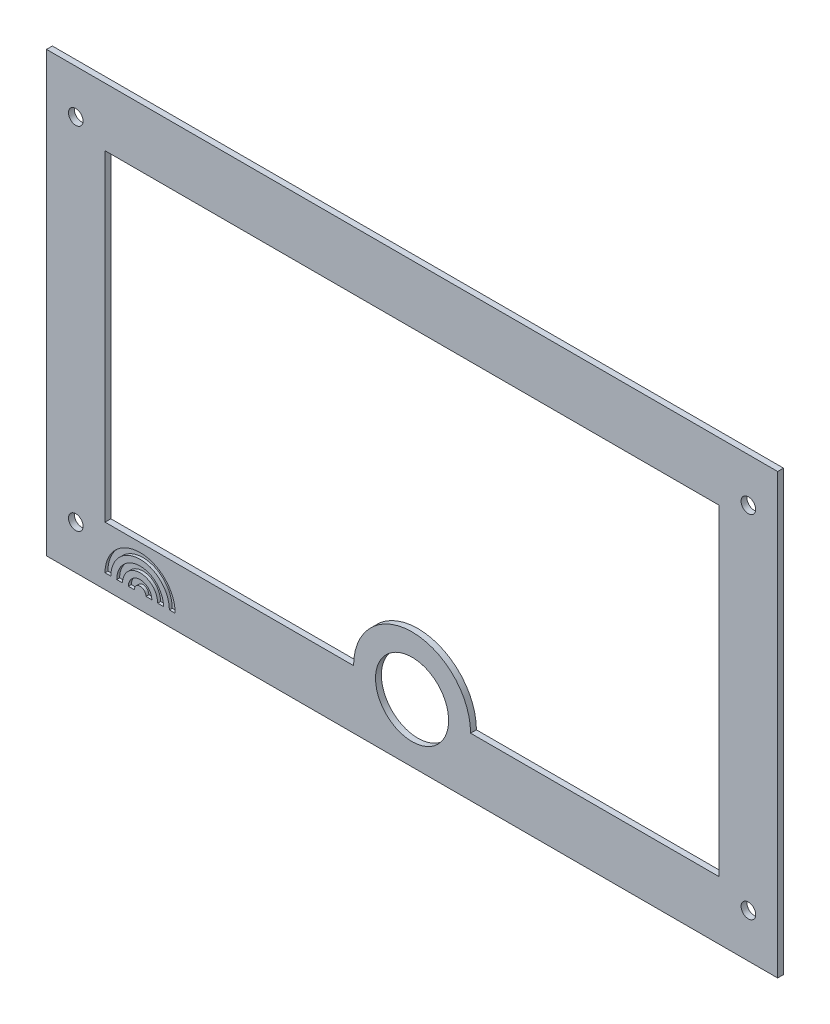
ISO-10303-21;
HEADER;
FILE_DESCRIPTION(('STEP AP214'),'2;1');
FILE_NAME('part.step','',(''),(''),'','','');
FILE_SCHEMA(('AUTOMOTIVE_DESIGN { 1 0 10303 214 1 1 1 1 }'));
ENDSEC;
DATA;
#1=APPLICATION_CONTEXT('core data for automotive mechanical design processes');
#2=APPLICATION_PROTOCOL_DEFINITION('international standard','automotive_design',2000,#1);
#3=PRODUCT_CONTEXT('',#1,'mechanical');
#4=PRODUCT('Part','Part','',(#3));
#5=PRODUCT_RELATED_PRODUCT_CATEGORY('part','',(#4));
#6=PRODUCT_DEFINITION_FORMATION('','',#4);
#7=PRODUCT_DEFINITION_CONTEXT('part definition',#1,'design');
#8=PRODUCT_DEFINITION('design','',#6,#7);
#9=PRODUCT_DEFINITION_SHAPE('','',#8);
#10=(LENGTH_UNIT() NAMED_UNIT(*) SI_UNIT(.MILLI.,.METRE.));
#11=(NAMED_UNIT(*) PLANE_ANGLE_UNIT() SI_UNIT($,.RADIAN.));
#12=(NAMED_UNIT(*) SI_UNIT($,.STERADIAN.) SOLID_ANGLE_UNIT());
#13=UNCERTAINTY_MEASURE_WITH_UNIT(LENGTH_MEASURE(1.E-05),#10,'distance_accuracy_value','');
#14=(GEOMETRIC_REPRESENTATION_CONTEXT(3) GLOBAL_UNCERTAINTY_ASSIGNED_CONTEXT((#13)) GLOBAL_UNIT_ASSIGNED_CONTEXT((#10,
#11,#12)) REPRESENTATION_CONTEXT('',''));
#15=CARTESIAN_POINT('',(0.,0.,0.));
#16=DIRECTION('',(0.,0.,1.));
#17=DIRECTION('',(1.,0.,0.));
#18=AXIS2_PLACEMENT_3D('',#15,#16,#17);
#19=CARTESIAN_POINT('',(-125.,-75.,2.));
#20=DIRECTION('',(0.,-1.,0.));
#21=DIRECTION('',(0.,0.,-1.));
#22=AXIS2_PLACEMENT_3D('',#19,#20,#21);
#23=PLANE('',#22);
#24=DIRECTION('',(1.,0.,0.));
#25=VECTOR('',#24,1.);
#26=CARTESIAN_POINT('',(0.,-75.,2.));
#27=LINE('',#26,#25);
#28=CARTESIAN_POINT('',(-125.,-75.,2.));
#29=VERTEX_POINT('',#28);
#30=CARTESIAN_POINT('',(125.,-75.,2.));
#31=VERTEX_POINT('',#30);
#32=EDGE_CURVE('E314',#29,#31,#27,.T.);
#33=ORIENTED_EDGE('',*,*,#32,.F.);
#34=DIRECTION('',(0.,0.,1.));
#35=VECTOR('',#34,1.);
#36=CARTESIAN_POINT('',(-125.,-75.,1.));
#37=LINE('',#36,#35);
#38=CARTESIAN_POINT('',(-125.,-75.,0.));
#39=VERTEX_POINT('',#38);
#40=EDGE_CURVE('E381',#39,#29,#37,.T.);
#41=ORIENTED_EDGE('',*,*,#40,.F.);
#42=DIRECTION('',(1.,0.,0.));
#43=VECTOR('',#42,1.);
#44=CARTESIAN_POINT('',(0.,-75.,0.));
#45=LINE('',#44,#43);
#46=CARTESIAN_POINT('',(125.,-75.,0.));
#47=VERTEX_POINT('',#46);
#48=EDGE_CURVE('E329',#39,#47,#45,.T.);
#49=ORIENTED_EDGE('',*,*,#48,.T.);
#50=DIRECTION('',(0.,0.,-1.));
#51=VECTOR('',#50,1.);
#52=CARTESIAN_POINT('',(125.,-75.,1.));
#53=LINE('',#52,#51);
#54=EDGE_CURVE('E286',#31,#47,#53,.T.);
#55=ORIENTED_EDGE('',*,*,#54,.F.);
#56=EDGE_LOOP('',(#33,#41,#49,#55));
#57=FACE_BOUND('',#56,.T.);
#58=ADVANCED_FACE('F50',(#57),#23,.T.);
#59=CARTESIAN_POINT('',(125.,-75.,2.));
#60=DIRECTION('',(1.,0.,0.));
#61=DIRECTION('',(0.,0.,-1.));
#62=AXIS2_PLACEMENT_3D('',#59,#60,#61);
#63=PLANE('',#62);
#64=DIRECTION('',(0.,1.,0.));
#65=VECTOR('',#64,1.);
#66=CARTESIAN_POINT('',(125.,0.,2.));
#67=LINE('',#66,#65);
#68=CARTESIAN_POINT('',(125.,75.,2.));
#69=VERTEX_POINT('',#68);
#70=EDGE_CURVE('E315',#31,#69,#67,.T.);
#71=ORIENTED_EDGE('',*,*,#70,.F.);
#72=ORIENTED_EDGE('',*,*,#54,.T.);
#73=DIRECTION('',(0.,1.,0.));
#74=VECTOR('',#73,1.);
#75=CARTESIAN_POINT('',(125.,0.,0.));
#76=LINE('',#75,#74);
#77=CARTESIAN_POINT('',(125.,75.,0.));
#78=VERTEX_POINT('',#77);
#79=EDGE_CURVE('E338',#47,#78,#76,.T.);
#80=ORIENTED_EDGE('',*,*,#79,.T.);
#81=DIRECTION('',(0.,0.,-1.));
#82=VECTOR('',#81,1.);
#83=CARTESIAN_POINT('',(125.,75.,1.));
#84=LINE('',#83,#82);
#85=EDGE_CURVE('E382',#69,#78,#84,.T.);
#86=ORIENTED_EDGE('',*,*,#85,.F.);
#87=EDGE_LOOP('',(#71,#72,#80,#86));
#88=FACE_BOUND('',#87,.T.);
#89=ADVANCED_FACE('F446',(#88),#63,.T.);
#90=CARTESIAN_POINT('',(-125.,75.,0.));
#91=DIRECTION('',(0.,1.,0.));
#92=DIRECTION('',(0.,0.,1.));
#93=AXIS2_PLACEMENT_3D('',#90,#91,#92);
#94=PLANE('',#93);
#95=DIRECTION('',(-1.,0.,0.));
#96=VECTOR('',#95,1.);
#97=CARTESIAN_POINT('',(0.,75.,2.));
#98=LINE('',#97,#96);
#99=CARTESIAN_POINT('',(-125.,75.,2.));
#100=VERTEX_POINT('',#99);
#101=EDGE_CURVE('E309',#69,#100,#98,.T.);
#102=ORIENTED_EDGE('',*,*,#101,.F.);
#103=ORIENTED_EDGE('',*,*,#85,.T.);
#104=DIRECTION('',(-1.,0.,0.));
#105=VECTOR('',#104,1.);
#106=CARTESIAN_POINT('',(0.,75.,0.));
#107=LINE('',#106,#105);
#108=CARTESIAN_POINT('',(-125.,75.,0.));
#109=VERTEX_POINT('',#108);
#110=EDGE_CURVE('E339',#78,#109,#107,.T.);
#111=ORIENTED_EDGE('',*,*,#110,.T.);
#112=DIRECTION('',(0.,0.,-1.));
#113=VECTOR('',#112,1.);
#114=CARTESIAN_POINT('',(-125.,75.,1.));
#115=LINE('',#114,#113);
#116=EDGE_CURVE('E367',#100,#109,#115,.T.);
#117=ORIENTED_EDGE('',*,*,#116,.F.);
#118=EDGE_LOOP('',(#102,#103,#111,#117));
#119=FACE_BOUND('',#118,.T.);
#120=ADVANCED_FACE('F445',(#119),#94,.T.);
#121=CARTESIAN_POINT('',(-125.,-75.,0.));
#122=DIRECTION('',(-1.,0.,0.));
#123=DIRECTION('',(0.,0.,1.));
#124=AXIS2_PLACEMENT_3D('',#121,#122,#123);
#125=PLANE('',#124);
#126=DIRECTION('',(0.,-1.,0.));
#127=VECTOR('',#126,1.);
#128=CARTESIAN_POINT('',(-125.,0.,2.));
#129=LINE('',#128,#127);
#130=EDGE_CURVE('E308',#100,#29,#129,.T.);
#131=ORIENTED_EDGE('',*,*,#130,.F.);
#132=ORIENTED_EDGE('',*,*,#116,.T.);
#133=DIRECTION('',(0.,-1.,0.));
#134=VECTOR('',#133,1.);
#135=CARTESIAN_POINT('',(-125.,0.,0.));
#136=LINE('',#135,#134);
#137=EDGE_CURVE('E334',#109,#39,#136,.T.);
#138=ORIENTED_EDGE('',*,*,#137,.T.);
#139=ORIENTED_EDGE('',*,*,#40,.T.);
#140=EDGE_LOOP('',(#131,#132,#138,#139));
#141=FACE_BOUND('',#140,.T.);
#142=ADVANCED_FACE('F453',(#141),#125,.T.);
#143=CARTESIAN_POINT('',(115.,-60.,0.));
#144=DIRECTION('',(0.,0.,1.));
#145=DIRECTION('',(1.,0.,0.));
#146=AXIS2_PLACEMENT_3D('',#143,#144,#145);
#147=CYLINDRICAL_SURFACE('',#146,2.5);
#148=CARTESIAN_POINT('',(115.,-60.,2.));
#149=DIRECTION('',(0.,0.,1.));
#150=DIRECTION('',(1.,0.,0.));
#151=AXIS2_PLACEMENT_3D('',#148,#149,#150);
#152=CIRCLE('',#151,2.5);
#153=CARTESIAN_POINT('',(117.5,-60.,2.));
#154=VERTEX_POINT('',#153);
#155=EDGE_CURVE('E310',#154,#154,#152,.F.);
#156=ORIENTED_EDGE('',*,*,#155,.F.);
#157=EDGE_LOOP('',(#156));
#158=FACE_BOUND('',#157,.T.);
#159=CARTESIAN_POINT('',(115.,-60.,0.));
#160=DIRECTION('',(0.,0.,1.));
#161=DIRECTION('',(1.,0.,0.));
#162=AXIS2_PLACEMENT_3D('',#159,#160,#161);
#163=CIRCLE('',#162,2.5);
#164=CARTESIAN_POINT('',(117.5,-60.,0.));
#165=VERTEX_POINT('',#164);
#166=EDGE_CURVE('E51',#165,#165,#163,.F.);
#167=ORIENTED_EDGE('',*,*,#166,.T.);
#168=EDGE_LOOP('',(#167));
#169=FACE_BOUND('',#168,.T.);
#170=ADVANCED_FACE('F422',(#158,#169),#147,.F.);
#171=CARTESIAN_POINT('',(115.,60.,0.));
#172=DIRECTION('',(0.,0.,1.));
#173=DIRECTION('',(1.,0.,0.));
#174=AXIS2_PLACEMENT_3D('',#171,#172,#173);
#175=CYLINDRICAL_SURFACE('',#174,2.5);
#176=CARTESIAN_POINT('',(115.,60.,2.));
#177=DIRECTION('',(0.,0.,1.));
#178=DIRECTION('',(1.,0.,0.));
#179=AXIS2_PLACEMENT_3D('',#176,#177,#178);
#180=CIRCLE('',#179,2.5);
#181=CARTESIAN_POINT('',(117.5,60.,2.));
#182=VERTEX_POINT('',#181);
#183=EDGE_CURVE('E410',#182,#182,#180,.F.);
#184=ORIENTED_EDGE('',*,*,#183,.F.);
#185=EDGE_LOOP('',(#184));
#186=FACE_BOUND('',#185,.T.);
#187=CARTESIAN_POINT('',(115.,60.,0.));
#188=DIRECTION('',(0.,0.,1.));
#189=DIRECTION('',(1.,0.,0.));
#190=AXIS2_PLACEMENT_3D('',#187,#188,#189);
#191=CIRCLE('',#190,2.5);
#192=CARTESIAN_POINT('',(117.5,60.,0.));
#193=VERTEX_POINT('',#192);
#194=EDGE_CURVE('E416',#193,#193,#191,.F.);
#195=ORIENTED_EDGE('',*,*,#194,.T.);
#196=EDGE_LOOP('',(#195));
#197=FACE_BOUND('',#196,.T.);
#198=ADVANCED_FACE('F521',(#186,#197),#175,.F.);
#199=CARTESIAN_POINT('',(-115.,60.,0.));
#200=DIRECTION('',(0.,0.,1.));
#201=DIRECTION('',(1.,0.,0.));
#202=AXIS2_PLACEMENT_3D('',#199,#200,#201);
#203=CYLINDRICAL_SURFACE('',#202,2.5);
#204=CARTESIAN_POINT('',(-115.,60.,2.));
#205=DIRECTION('',(0.,0.,1.));
#206=DIRECTION('',(1.,0.,0.));
#207=AXIS2_PLACEMENT_3D('',#204,#205,#206);
#208=CIRCLE('',#207,2.5);
#209=CARTESIAN_POINT('',(-112.5,60.,2.));
#210=VERTEX_POINT('',#209);
#211=EDGE_CURVE('E403',#210,#210,#208,.F.);
#212=ORIENTED_EDGE('',*,*,#211,.F.);
#213=EDGE_LOOP('',(#212));
#214=FACE_BOUND('',#213,.T.);
#215=CARTESIAN_POINT('',(-115.,60.,0.));
#216=DIRECTION('',(0.,0.,1.));
#217=DIRECTION('',(1.,0.,0.));
#218=AXIS2_PLACEMENT_3D('',#215,#216,#217);
#219=CIRCLE('',#218,2.5);
#220=CARTESIAN_POINT('',(-112.5,60.,0.));
#221=VERTEX_POINT('',#220);
#222=EDGE_CURVE('E330',#221,#221,#219,.F.);
#223=ORIENTED_EDGE('',*,*,#222,.T.);
#224=EDGE_LOOP('',(#223));
#225=FACE_BOUND('',#224,.T.);
#226=ADVANCED_FACE('F518',(#214,#225),#203,.F.);
#227=CARTESIAN_POINT('',(0.,-55.,2.));
#228=DIRECTION('',(0.,0.,-1.));
#229=DIRECTION('',(-1.,0.,0.));
#230=AXIS2_PLACEMENT_3D('',#227,#228,#229);
#231=CYLINDRICAL_SURFACE('',#230,12.5);
#232=CARTESIAN_POINT('',(0.,-55.,2.));
#233=DIRECTION('',(0.,0.,-1.));
#234=DIRECTION('',(-1.,0.,0.));
#235=AXIS2_PLACEMENT_3D('',#232,#233,#234);
#236=CIRCLE('',#235,12.5);
#237=CARTESIAN_POINT('',(-12.5,-55.,2.));
#238=VERTEX_POINT('',#237);
#239=EDGE_CURVE('E372',#238,#238,#236,.T.);
#240=ORIENTED_EDGE('',*,*,#239,.F.);
#241=EDGE_LOOP('',(#240));
#242=FACE_BOUND('',#241,.T.);
#243=CARTESIAN_POINT('',(0.,-55.,0.));
#244=DIRECTION('',(0.,0.,-1.));
#245=DIRECTION('',(-1.,0.,0.));
#246=AXIS2_PLACEMENT_3D('',#243,#244,#245);
#247=CIRCLE('',#246,12.5);
#248=CARTESIAN_POINT('',(-12.5,-55.,0.));
#249=VERTEX_POINT('',#248);
#250=EDGE_CURVE('E316',#249,#249,#247,.T.);
#251=ORIENTED_EDGE('',*,*,#250,.T.);
#252=EDGE_LOOP('',(#251));
#253=FACE_BOUND('',#252,.T.);
#254=ADVANCED_FACE('F513',(#242,#253),#231,.F.);
#255=CARTESIAN_POINT('',(105.,55.00000005,0.));
#256=DIRECTION('',(0.,1.,0.));
#257=DIRECTION('',(-1.,0.,0.));
#258=AXIS2_PLACEMENT_3D('',#255,#256,#257);
#259=PLANE('',#258);
#260=DIRECTION('',(0.,0.,1.));
#261=VECTOR('',#260,1.);
#262=CARTESIAN_POINT('',(105.,55.00000005,1.));
#263=LINE('',#262,#261);
#264=CARTESIAN_POINT('',(105.,55.00000005,0.));
#265=VERTEX_POINT('',#264);
#266=CARTESIAN_POINT('',(105.,55.00000005,2.));
#267=VERTEX_POINT('',#266);
#268=EDGE_CURVE('E363',#265,#267,#263,.T.);
#269=ORIENTED_EDGE('',*,*,#268,.T.);
#270=DIRECTION('',(1.,0.,0.));
#271=VECTOR('',#270,1.);
#272=CARTESIAN_POINT('',(0.,55.00000005,2.));
#273=LINE('',#272,#271);
#274=CARTESIAN_POINT('',(-105.,55.00000005,2.));
#275=VERTEX_POINT('',#274);
#276=EDGE_CURVE('E364',#275,#267,#273,.T.);
#277=ORIENTED_EDGE('',*,*,#276,.F.);
#278=DIRECTION('',(0.,0.,-1.));
#279=VECTOR('',#278,1.);
#280=CARTESIAN_POINT('',(-105.,55.00000005,1.));
#281=LINE('',#280,#279);
#282=CARTESIAN_POINT('',(-105.,55.00000005,0.));
#283=VERTEX_POINT('',#282);
#284=EDGE_CURVE('E345',#275,#283,#281,.T.);
#285=ORIENTED_EDGE('',*,*,#284,.T.);
#286=DIRECTION('',(1.,0.,0.));
#287=VECTOR('',#286,1.);
#288=CARTESIAN_POINT('',(0.,55.00000005,0.));
#289=LINE('',#288,#287);
#290=EDGE_CURVE('E389',#283,#265,#289,.T.);
#291=ORIENTED_EDGE('',*,*,#290,.T.);
#292=EDGE_LOOP('',(#269,#277,#285,#291));
#293=FACE_BOUND('',#292,.T.);
#294=ADVANCED_FACE('F520',(#293),#259,.F.);
#295=CARTESIAN_POINT('',(105.,-55.000000025,2.));
#296=DIRECTION('',(1.,0.,0.));
#297=DIRECTION('',(0.,0.,-1.));
#298=AXIS2_PLACEMENT_3D('',#295,#296,#297);
#299=PLANE('',#298);
#300=DIRECTION('',(0.,0.,1.));
#301=VECTOR('',#300,1.);
#302=CARTESIAN_POINT('',(105.,-55.000000025,1.));
#303=LINE('',#302,#301);
#304=CARTESIAN_POINT('',(105.,-55.0000000361111,0.));
#305=VERTEX_POINT('',#304);
#306=CARTESIAN_POINT('',(105.,-55.0000000416667,2.));
#307=VERTEX_POINT('',#306);
#308=EDGE_CURVE('E356',#305,#307,#303,.T.);
#309=ORIENTED_EDGE('',*,*,#308,.T.);
#310=DIRECTION('',(0.,-1.,0.));
#311=VECTOR('',#310,1.);
#312=CARTESIAN_POINT('',(105.,0.,2.));
#313=LINE('',#312,#311);
#314=EDGE_CURVE('E301',#267,#307,#313,.T.);
#315=ORIENTED_EDGE('',*,*,#314,.F.);
#316=ORIENTED_EDGE('',*,*,#268,.F.);
#317=DIRECTION('',(0.,-1.,0.));
#318=VECTOR('',#317,1.);
#319=CARTESIAN_POINT('',(105.,0.,0.));
#320=LINE('',#319,#318);
#321=EDGE_CURVE('E394',#265,#305,#320,.T.);
#322=ORIENTED_EDGE('',*,*,#321,.T.);
#323=EDGE_LOOP('',(#309,#315,#316,#322));
#324=FACE_BOUND('',#323,.T.);
#325=ADVANCED_FACE('F541',(#324),#299,.F.);
#326=CARTESIAN_POINT('',(20.,-55.000000025,2.));
#327=DIRECTION('',(0.,-1.,0.));
#328=DIRECTION('',(0.,0.,-1.));
#329=AXIS2_PLACEMENT_3D('',#326,#327,#328);
#330=PLANE('',#329);
#331=DIRECTION('',(0.,0.,-1.));
#332=VECTOR('',#331,1.);
#333=CARTESIAN_POINT('',(20.,-55.0000000282041,1.));
#334=LINE('',#333,#332);
#335=CARTESIAN_POINT('',(20.,-55.0000000391021,0.));
#336=VERTEX_POINT('',#335);
#337=CARTESIAN_POINT('',(20.,-55.0000000391021,2.));
#338=VERTEX_POINT('',#337);
#339=EDGE_CURVE('E350',#336,#338,#334,.F.);
#340=ORIENTED_EDGE('',*,*,#339,.T.);
#341=DIRECTION('',(-1.,0.,0.));
#342=VECTOR('',#341,1.);
#343=CARTESIAN_POINT('',(0.,-55.00000005,2.));
#344=LINE('',#343,#342);
#345=EDGE_CURVE('E303',#307,#338,#344,.T.);
#346=ORIENTED_EDGE('',*,*,#345,.F.);
#347=ORIENTED_EDGE('',*,*,#308,.F.);
#348=DIRECTION('',(-1.,0.,0.));
#349=VECTOR('',#348,1.);
#350=CARTESIAN_POINT('',(0.,-55.00000005,0.));
#351=LINE('',#350,#349);
#352=EDGE_CURVE('E322',#305,#336,#351,.T.);
#353=ORIENTED_EDGE('',*,*,#352,.T.);
#354=EDGE_LOOP('',(#340,#346,#347,#353));
#355=FACE_BOUND('',#354,.T.);
#356=ADVANCED_FACE('F511',(#355),#330,.F.);
#357=CARTESIAN_POINT('',(0.,-55.,2.));
#358=DIRECTION('',(0.,0.,-1.));
#359=DIRECTION('',(-1.,0.,0.));
#360=AXIS2_PLACEMENT_3D('',#357,#358,#359);
#361=CYLINDRICAL_SURFACE('',#360,20.);
#362=DIRECTION('',(0.,0.,1.));
#363=VECTOR('',#362,1.);
#364=CARTESIAN_POINT('',(-20.,-55.000000029,1.));
#365=LINE('',#364,#363);
#366=CARTESIAN_POINT('',(-20.,-55.0000000395,0.));
#367=VERTEX_POINT('',#366);
#368=CARTESIAN_POINT('',(-20.,-55.0000000395,2.));
#369=VERTEX_POINT('',#368);
#370=EDGE_CURVE('E341',#367,#369,#365,.T.);
#371=ORIENTED_EDGE('',*,*,#370,.T.);
#372=CARTESIAN_POINT('',(0.,-55.,2.));
#373=DIRECTION('',(0.,0.,-1.));
#374=DIRECTION('',(-1.,0.,0.));
#375=AXIS2_PLACEMENT_3D('',#372,#373,#374);
#376=CIRCLE('',#375,20.);
#377=EDGE_CURVE('E300',#338,#369,#376,.F.);
#378=ORIENTED_EDGE('',*,*,#377,.F.);
#379=ORIENTED_EDGE('',*,*,#339,.F.);
#380=CARTESIAN_POINT('',(0.,-55.,0.));
#381=DIRECTION('',(0.,0.,-1.));
#382=DIRECTION('',(-1.,0.,0.));
#383=AXIS2_PLACEMENT_3D('',#380,#381,#382);
#384=CIRCLE('',#383,20.);
#385=EDGE_CURVE('E321',#336,#367,#384,.F.);
#386=ORIENTED_EDGE('',*,*,#385,.T.);
#387=EDGE_LOOP('',(#371,#378,#379,#386));
#388=FACE_BOUND('',#387,.T.);
#389=ADVANCED_FACE('F507',(#388),#361,.T.);
#390=CARTESIAN_POINT('',(-105.,-55.000000029,2.));
#391=DIRECTION('',(0.,-1.,0.));
#392=DIRECTION('',(0.,0.,-1.));
#393=AXIS2_PLACEMENT_3D('',#390,#391,#392);
#394=PLANE('',#393);
#395=DIRECTION('',(0.,0.,1.));
#396=VECTOR('',#395,1.);
#397=CARTESIAN_POINT('',(-105.,-55.000000029,1.));
#398=LINE('',#397,#396);
#399=CARTESIAN_POINT('',(-105.,-55.0000000383333,0.));
#400=VERTEX_POINT('',#399);
#401=CARTESIAN_POINT('',(-105.,-55.000000043,2.));
#402=VERTEX_POINT('',#401);
#403=EDGE_CURVE('E347',#400,#402,#398,.T.);
#404=ORIENTED_EDGE('',*,*,#403,.T.);
#405=DIRECTION('',(-1.,0.,0.));
#406=VECTOR('',#405,1.);
#407=CARTESIAN_POINT('',(0.,-55.00000005,2.));
#408=LINE('',#407,#406);
#409=EDGE_CURVE('E293',#369,#402,#408,.T.);
#410=ORIENTED_EDGE('',*,*,#409,.F.);
#411=ORIENTED_EDGE('',*,*,#370,.F.);
#412=DIRECTION('',(-1.,0.,0.));
#413=VECTOR('',#412,1.);
#414=CARTESIAN_POINT('',(0.,-55.00000005,0.));
#415=LINE('',#414,#413);
#416=EDGE_CURVE('E320',#367,#400,#415,.T.);
#417=ORIENTED_EDGE('',*,*,#416,.T.);
#418=EDGE_LOOP('',(#404,#410,#411,#417));
#419=FACE_BOUND('',#418,.T.);
#420=ADVANCED_FACE('F515',(#419),#394,.F.);
#421=CARTESIAN_POINT('',(-105.,-55.000000029,0.));
#422=DIRECTION('',(-1.,0.,0.));
#423=DIRECTION('',(0.,0.,1.));
#424=AXIS2_PLACEMENT_3D('',#421,#422,#423);
#425=PLANE('',#424);
#426=ORIENTED_EDGE('',*,*,#284,.F.);
#427=DIRECTION('',(0.,1.,0.));
#428=VECTOR('',#427,1.);
#429=CARTESIAN_POINT('',(-105.,0.,2.));
#430=LINE('',#429,#428);
#431=EDGE_CURVE('E296',#402,#275,#430,.T.);
#432=ORIENTED_EDGE('',*,*,#431,.F.);
#433=ORIENTED_EDGE('',*,*,#403,.F.);
#434=DIRECTION('',(0.,1.,0.));
#435=VECTOR('',#434,1.);
#436=CARTESIAN_POINT('',(-105.,0.,0.));
#437=LINE('',#436,#435);
#438=EDGE_CURVE('E319',#400,#283,#437,.T.);
#439=ORIENTED_EDGE('',*,*,#438,.T.);
#440=EDGE_LOOP('',(#426,#432,#433,#439));
#441=FACE_BOUND('',#440,.T.);
#442=ADVANCED_FACE('F429',(#441),#425,.F.);
#443=CARTESIAN_POINT('',(-125.,-75.,0.));
#444=DIRECTION('',(0.,0.,1.));
#445=DIRECTION('',(1.,0.,0.));
#446=AXIS2_PLACEMENT_3D('',#443,#444,#445);
#447=PLANE('',#446);
#448=ORIENTED_EDGE('',*,*,#250,.F.);
#449=EDGE_LOOP('',(#448));
#450=FACE_BOUND('',#449,.T.);
#451=ORIENTED_EDGE('',*,*,#290,.F.);
#452=ORIENTED_EDGE('',*,*,#438,.F.);
#453=ORIENTED_EDGE('',*,*,#416,.F.);
#454=ORIENTED_EDGE('',*,*,#385,.F.);
#455=ORIENTED_EDGE('',*,*,#352,.F.);
#456=ORIENTED_EDGE('',*,*,#321,.F.);
#457=EDGE_LOOP('',(#451,#452,#453,#454,#455,#456));
#458=FACE_BOUND('',#457,.T.);
#459=ORIENTED_EDGE('',*,*,#222,.F.);
#460=EDGE_LOOP('',(#459));
#461=FACE_BOUND('',#460,.T.);
#462=ORIENTED_EDGE('',*,*,#194,.F.);
#463=EDGE_LOOP('',(#462));
#464=FACE_BOUND('',#463,.T.);
#465=ORIENTED_EDGE('',*,*,#166,.F.);
#466=EDGE_LOOP('',(#465));
#467=FACE_BOUND('',#466,.T.);
#468=CARTESIAN_POINT('',(-115.,-60.,0.));
#469=DIRECTION('',(0.,0.,1.));
#470=DIRECTION('',(1.,0.,0.));
#471=AXIS2_PLACEMENT_3D('',#468,#469,#470);
#472=CIRCLE('',#471,2.5);
#473=CARTESIAN_POINT('',(-112.5,-60.,0.));
#474=VERTEX_POINT('',#473);
#475=EDGE_CURVE('E57',#474,#474,#472,.F.);
#476=ORIENTED_EDGE('',*,*,#475,.F.);
#477=EDGE_LOOP('',(#476));
#478=FACE_BOUND('',#477,.T.);
#479=ORIENTED_EDGE('',*,*,#137,.F.);
#480=ORIENTED_EDGE('',*,*,#110,.F.);
#481=ORIENTED_EDGE('',*,*,#79,.F.);
#482=ORIENTED_EDGE('',*,*,#48,.F.);
#483=EDGE_LOOP('',(#479,#480,#481,#482));
#484=FACE_BOUND('',#483,.T.);
#485=ADVANCED_FACE('F430',(#450,#458,#461,#464,#467,#478,#484),#447,.F.);
#486=CARTESIAN_POINT('',(-125.,-75.,2.));
#487=DIRECTION('',(0.,0.,1.));
#488=DIRECTION('',(1.,0.,0.));
#489=AXIS2_PLACEMENT_3D('',#486,#487,#488);
#490=PLANE('',#489);
#491=CARTESIAN_POINT('',(-93.,-70.,2.));
#492=DIRECTION('',(0.,0.,-1.));
#493=DIRECTION('',(1.,0.,0.));
#494=AXIS2_PLACEMENT_3D('',#491,#492,#493);
#495=CIRCLE('',#494,2.);
#496=CARTESIAN_POINT('',(-95.,-70.,2.));
#497=VERTEX_POINT('',#496);
#498=CARTESIAN_POINT('',(-91.,-70.,2.));
#499=VERTEX_POINT('',#498);
#500=EDGE_CURVE('E63',#497,#499,#495,.T.);
#501=ORIENTED_EDGE('',*,*,#500,.F.);
#502=DIRECTION('',(1.,0.,0.));
#503=VECTOR('',#502,1.);
#504=CARTESIAN_POINT('',(-97.,-70.,2.));
#505=LINE('',#504,#503);
#506=CARTESIAN_POINT('',(-97.,-70.,2.));
#507=VERTEX_POINT('',#506);
#508=EDGE_CURVE('E244',#507,#497,#505,.T.);
#509=ORIENTED_EDGE('',*,*,#508,.F.);
#510=CARTESIAN_POINT('',(-93.,-70.,2.));
#511=DIRECTION('',(0.,0.,1.));
#512=DIRECTION('',(1.,0.,0.));
#513=AXIS2_PLACEMENT_3D('',#510,#511,#512);
#514=CIRCLE('',#513,4.);
#515=CARTESIAN_POINT('',(-89.,-70.,2.));
#516=VERTEX_POINT('',#515);
#517=EDGE_CURVE('E243',#516,#507,#514,.T.);
#518=ORIENTED_EDGE('',*,*,#517,.F.);
#519=DIRECTION('',(1.,0.,0.));
#520=VECTOR('',#519,1.);
#521=CARTESIAN_POINT('',(-91.,-70.,2.));
#522=LINE('',#521,#520);
#523=EDGE_CURVE('E246',#499,#516,#522,.T.);
#524=ORIENTED_EDGE('',*,*,#523,.F.);
#525=EDGE_LOOP('',(#501,#509,#518,#524));
#526=FACE_BOUND('',#525,.T.);
#527=CARTESIAN_POINT('',(-93.,-70.,2.));
#528=DIRECTION('',(0.,0.,-1.));
#529=DIRECTION('',(1.,0.,0.));
#530=AXIS2_PLACEMENT_3D('',#527,#528,#529);
#531=CIRCLE('',#530,6.00000000000001);
#532=CARTESIAN_POINT('',(-99.,-70.,2.));
#533=VERTEX_POINT('',#532);
#534=CARTESIAN_POINT('',(-87.,-70.,2.));
#535=VERTEX_POINT('',#534);
#536=EDGE_CURVE('E75',#533,#535,#531,.T.);
#537=ORIENTED_EDGE('',*,*,#536,.F.);
#538=DIRECTION('',(1.,0.,0.));
#539=VECTOR('',#538,1.);
#540=CARTESIAN_POINT('',(-101.,-70.,2.));
#541=LINE('',#540,#539);
#542=CARTESIAN_POINT('',(-101.,-70.,2.));
#543=VERTEX_POINT('',#542);
#544=EDGE_CURVE('E210',#543,#533,#541,.T.);
#545=ORIENTED_EDGE('',*,*,#544,.F.);
#546=CARTESIAN_POINT('',(-93.,-70.,2.));
#547=DIRECTION('',(0.,0.,1.));
#548=DIRECTION('',(1.,0.,0.));
#549=AXIS2_PLACEMENT_3D('',#546,#547,#548);
#550=CIRCLE('',#549,8.00000000000001);
#551=CARTESIAN_POINT('',(-85.,-70.,2.));
#552=VERTEX_POINT('',#551);
#553=EDGE_CURVE('E215',#552,#543,#550,.T.);
#554=ORIENTED_EDGE('',*,*,#553,.F.);
#555=DIRECTION('',(1.,0.,0.));
#556=VECTOR('',#555,1.);
#557=CARTESIAN_POINT('',(-87.,-70.,2.));
#558=LINE('',#557,#556);
#559=EDGE_CURVE('E220',#535,#552,#558,.T.);
#560=ORIENTED_EDGE('',*,*,#559,.F.);
#561=EDGE_LOOP('',(#537,#545,#554,#560));
#562=FACE_BOUND('',#561,.T.);
#563=CARTESIAN_POINT('',(-93.,-70.,2.));
#564=DIRECTION('',(0.,0.,1.));
#565=DIRECTION('',(1.,0.,0.));
#566=AXIS2_PLACEMENT_3D('',#563,#564,#565);
#567=CIRCLE('',#566,12.);
#568=CARTESIAN_POINT('',(-81.,-70.,2.));
#569=VERTEX_POINT('',#568);
#570=CARTESIAN_POINT('',(-105.,-70.,2.));
#571=VERTEX_POINT('',#570);
#572=EDGE_CURVE('E252',#569,#571,#567,.T.);
#573=ORIENTED_EDGE('',*,*,#572,.F.);
#574=DIRECTION('',(1.,0.,0.));
#575=VECTOR('',#574,1.);
#576=CARTESIAN_POINT('',(-83.,-70.,2.));
#577=LINE('',#576,#575);
#578=CARTESIAN_POINT('',(-83.,-70.,2.));
#579=VERTEX_POINT('',#578);
#580=EDGE_CURVE('E270',#579,#569,#577,.T.);
#581=ORIENTED_EDGE('',*,*,#580,.F.);
#582=CARTESIAN_POINT('',(-93.,-70.,2.));
#583=DIRECTION('',(0.,0.,-1.));
#584=DIRECTION('',(1.,0.,0.));
#585=AXIS2_PLACEMENT_3D('',#582,#583,#584);
#586=CIRCLE('',#585,10.);
#587=CARTESIAN_POINT('',(-103.,-70.,2.));
#588=VERTEX_POINT('',#587);
#589=EDGE_CURVE('E284',#588,#579,#586,.T.);
#590=ORIENTED_EDGE('',*,*,#589,.F.);
#591=DIRECTION('',(1.,0.,0.));
#592=VECTOR('',#591,1.);
#593=CARTESIAN_POINT('',(-105.,-70.,2.));
#594=LINE('',#593,#592);
#595=EDGE_CURVE('E279',#571,#588,#594,.T.);
#596=ORIENTED_EDGE('',*,*,#595,.F.);
#597=EDGE_LOOP('',(#573,#581,#590,#596));
#598=FACE_BOUND('',#597,.T.);
#599=ORIENTED_EDGE('',*,*,#409,.T.);
#600=ORIENTED_EDGE('',*,*,#431,.T.);
#601=ORIENTED_EDGE('',*,*,#276,.T.);
#602=ORIENTED_EDGE('',*,*,#314,.T.);
#603=ORIENTED_EDGE('',*,*,#345,.T.);
#604=ORIENTED_EDGE('',*,*,#377,.T.);
#605=EDGE_LOOP('',(#599,#600,#601,#602,#603,#604));
#606=FACE_BOUND('',#605,.T.);
#607=ORIENTED_EDGE('',*,*,#239,.T.);
#608=EDGE_LOOP('',(#607));
#609=FACE_BOUND('',#608,.T.);
#610=ORIENTED_EDGE('',*,*,#211,.T.);
#611=EDGE_LOOP('',(#610));
#612=FACE_BOUND('',#611,.T.);
#613=ORIENTED_EDGE('',*,*,#183,.T.);
#614=EDGE_LOOP('',(#613));
#615=FACE_BOUND('',#614,.T.);
#616=ORIENTED_EDGE('',*,*,#155,.T.);
#617=EDGE_LOOP('',(#616));
#618=FACE_BOUND('',#617,.T.);
#619=CARTESIAN_POINT('',(-115.,-60.,2.));
#620=DIRECTION('',(0.,0.,1.));
#621=DIRECTION('',(1.,0.,0.));
#622=AXIS2_PLACEMENT_3D('',#619,#620,#621);
#623=CIRCLE('',#622,2.5);
#624=CARTESIAN_POINT('',(-112.5,-60.,2.));
#625=VERTEX_POINT('',#624);
#626=EDGE_CURVE('E11',#625,#625,#623,.T.);
#627=ORIENTED_EDGE('',*,*,#626,.F.);
#628=EDGE_LOOP('',(#627));
#629=FACE_BOUND('',#628,.T.);
#630=ORIENTED_EDGE('',*,*,#101,.T.);
#631=ORIENTED_EDGE('',*,*,#130,.T.);
#632=ORIENTED_EDGE('',*,*,#32,.T.);
#633=ORIENTED_EDGE('',*,*,#70,.T.);
#634=EDGE_LOOP('',(#630,#631,#632,#633));
#635=FACE_BOUND('',#634,.T.);
#636=ADVANCED_FACE('F47',(#526,#562,#598,#606,#609,#612,#615,#618,#629,#635),#490,.T.);
#637=CARTESIAN_POINT('',(-115.,-60.,0.));
#638=DIRECTION('',(0.,0.,1.));
#639=DIRECTION('',(1.,0.,0.));
#640=AXIS2_PLACEMENT_3D('',#637,#638,#639);
#641=CYLINDRICAL_SURFACE('',#640,2.5);
#642=ORIENTED_EDGE('',*,*,#626,.T.);
#643=EDGE_LOOP('',(#642));
#644=FACE_BOUND('',#643,.T.);
#645=ORIENTED_EDGE('',*,*,#475,.T.);
#646=EDGE_LOOP('',(#645));
#647=FACE_BOUND('',#646,.T.);
#648=ADVANCED_FACE('F452',(#644,#647),#641,.F.);
#649=CARTESIAN_POINT('',(-93.,-70.,1.));
#650=DIRECTION('',(0.,0.,1.));
#651=DIRECTION('',(1.,0.,0.));
#652=AXIS2_PLACEMENT_3D('',#649,#650,#651);
#653=CYLINDRICAL_SURFACE('',#652,12.);
#654=ORIENTED_EDGE('',*,*,#572,.T.);
#655=DIRECTION('',(0.,0.,1.));
#656=VECTOR('',#655,1.);
#657=CARTESIAN_POINT('',(-105.,-70.,1.));
#658=LINE('',#657,#656);
#659=CARTESIAN_POINT('',(-105.,-70.,1.));
#660=VERTEX_POINT('',#659);
#661=EDGE_CURVE('E277',#660,#571,#658,.T.);
#662=ORIENTED_EDGE('',*,*,#661,.F.);
#663=CARTESIAN_POINT('',(-93.,-70.,1.));
#664=DIRECTION('',(0.,0.,1.));
#665=DIRECTION('',(1.,0.,0.));
#666=AXIS2_PLACEMENT_3D('',#663,#664,#665);
#667=CIRCLE('',#666,12.);
#668=CARTESIAN_POINT('',(-81.,-70.,1.));
#669=VERTEX_POINT('',#668);
#670=EDGE_CURVE('E263',#669,#660,#667,.T.);
#671=ORIENTED_EDGE('',*,*,#670,.F.);
#672=DIRECTION('',(0.,0.,1.));
#673=VECTOR('',#672,1.);
#674=CARTESIAN_POINT('',(-81.,-70.,1.));
#675=LINE('',#674,#673);
#676=EDGE_CURVE('E288',#669,#569,#675,.T.);
#677=ORIENTED_EDGE('',*,*,#676,.T.);
#678=EDGE_LOOP('',(#654,#662,#671,#677));
#679=FACE_BOUND('',#678,.T.);
#680=ADVANCED_FACE('F459',(#679),#653,.F.);
#681=CARTESIAN_POINT('',(-83.,-70.,1.));
#682=DIRECTION('',(0.,-1.,0.));
#683=DIRECTION('',(0.,0.,-1.));
#684=AXIS2_PLACEMENT_3D('',#681,#682,#683);
#685=PLANE('',#684);
#686=ORIENTED_EDGE('',*,*,#580,.T.);
#687=ORIENTED_EDGE('',*,*,#676,.F.);
#688=DIRECTION('',(1.,0.,0.));
#689=VECTOR('',#688,1.);
#690=CARTESIAN_POINT('',(-83.,-70.,1.));
#691=LINE('',#690,#689);
#692=CARTESIAN_POINT('',(-83.,-70.,1.));
#693=VERTEX_POINT('',#692);
#694=EDGE_CURVE('E272',#693,#669,#691,.T.);
#695=ORIENTED_EDGE('',*,*,#694,.F.);
#696=DIRECTION('',(0.,0.,1.));
#697=VECTOR('',#696,1.);
#698=CARTESIAN_POINT('',(-83.,-70.,1.));
#699=LINE('',#698,#697);
#700=EDGE_CURVE('E287',#693,#579,#699,.T.);
#701=ORIENTED_EDGE('',*,*,#700,.T.);
#702=EDGE_LOOP('',(#686,#687,#695,#701));
#703=FACE_BOUND('',#702,.T.);
#704=ADVANCED_FACE('F494',(#703),#685,.F.);
#705=CARTESIAN_POINT('',(-93.,-70.,1.));
#706=DIRECTION('',(0.,0.,1.));
#707=DIRECTION('',(1.,0.,0.));
#708=AXIS2_PLACEMENT_3D('',#705,#706,#707);
#709=CYLINDRICAL_SURFACE('',#708,10.);
#710=ORIENTED_EDGE('',*,*,#589,.T.);
#711=ORIENTED_EDGE('',*,*,#700,.F.);
#712=CARTESIAN_POINT('',(-93.,-70.,1.));
#713=DIRECTION('',(0.,0.,-1.));
#714=DIRECTION('',(1.,0.,0.));
#715=AXIS2_PLACEMENT_3D('',#712,#713,#714);
#716=CIRCLE('',#715,10.);
#717=CARTESIAN_POINT('',(-103.,-70.,1.));
#718=VERTEX_POINT('',#717);
#719=EDGE_CURVE('E269',#718,#693,#716,.T.);
#720=ORIENTED_EDGE('',*,*,#719,.F.);
#721=DIRECTION('',(0.,0.,1.));
#722=VECTOR('',#721,1.);
#723=CARTESIAN_POINT('',(-103.,-70.,1.));
#724=LINE('',#723,#722);
#725=EDGE_CURVE('E292',#718,#588,#724,.T.);
#726=ORIENTED_EDGE('',*,*,#725,.T.);
#727=EDGE_LOOP('',(#710,#711,#720,#726));
#728=FACE_BOUND('',#727,.T.);
#729=ADVANCED_FACE('F499',(#728),#709,.T.);
#730=CARTESIAN_POINT('',(-105.,-70.,1.));
#731=DIRECTION('',(0.,-1.,0.));
#732=DIRECTION('',(0.,0.,-1.));
#733=AXIS2_PLACEMENT_3D('',#730,#731,#732);
#734=PLANE('',#733);
#735=ORIENTED_EDGE('',*,*,#595,.T.);
#736=ORIENTED_EDGE('',*,*,#725,.F.);
#737=DIRECTION('',(1.,0.,0.));
#738=VECTOR('',#737,1.);
#739=CARTESIAN_POINT('',(-105.,-70.,1.));
#740=LINE('',#739,#738);
#741=EDGE_CURVE('E266',#660,#718,#740,.T.);
#742=ORIENTED_EDGE('',*,*,#741,.F.);
#743=ORIENTED_EDGE('',*,*,#661,.T.);
#744=EDGE_LOOP('',(#735,#736,#742,#743));
#745=FACE_BOUND('',#744,.T.);
#746=ADVANCED_FACE('F492',(#745),#734,.F.);
#747=CARTESIAN_POINT('',(-93.,-70.,1.));
#748=DIRECTION('',(0.,0.,1.));
#749=DIRECTION('',(1.,0.,0.));
#750=AXIS2_PLACEMENT_3D('',#747,#748,#749);
#751=PLANE('',#750);
#752=ORIENTED_EDGE('',*,*,#670,.T.);
#753=ORIENTED_EDGE('',*,*,#741,.T.);
#754=ORIENTED_EDGE('',*,*,#719,.T.);
#755=ORIENTED_EDGE('',*,*,#694,.T.);
#756=EDGE_LOOP('',(#752,#753,#754,#755));
#757=FACE_BOUND('',#756,.T.);
#758=ADVANCED_FACE('F489',(#757),#751,.T.);
#759=CARTESIAN_POINT('',(-93.,-70.,1.));
#760=DIRECTION('',(0.,0.,1.));
#761=DIRECTION('',(1.,0.,0.));
#762=AXIS2_PLACEMENT_3D('',#759,#760,#761);
#763=CYLINDRICAL_SURFACE('',#762,6.00000000000001);
#764=ORIENTED_EDGE('',*,*,#536,.T.);
#765=DIRECTION('',(0.,0.,1.));
#766=VECTOR('',#765,1.);
#767=CARTESIAN_POINT('',(-87.,-70.,1.));
#768=LINE('',#767,#766);
#769=CARTESIAN_POINT('',(-87.,-70.,1.));
#770=VERTEX_POINT('',#769);
#771=EDGE_CURVE('E230',#770,#535,#768,.T.);
#772=ORIENTED_EDGE('',*,*,#771,.F.);
#773=CARTESIAN_POINT('',(-93.,-70.,1.));
#774=DIRECTION('',(0.,0.,-1.));
#775=DIRECTION('',(1.,0.,0.));
#776=AXIS2_PLACEMENT_3D('',#773,#774,#775);
#777=CIRCLE('',#776,6.00000000000001);
#778=CARTESIAN_POINT('',(-99.,-70.,1.));
#779=VERTEX_POINT('',#778);
#780=EDGE_CURVE('E199',#779,#770,#777,.T.);
#781=ORIENTED_EDGE('',*,*,#780,.F.);
#782=DIRECTION('',(0.,0.,1.));
#783=VECTOR('',#782,1.);
#784=CARTESIAN_POINT('',(-99.,-70.,1.));
#785=LINE('',#784,#783);
#786=EDGE_CURVE('E198',#779,#533,#785,.T.);
#787=ORIENTED_EDGE('',*,*,#786,.T.);
#788=EDGE_LOOP('',(#764,#772,#781,#787));
#789=FACE_BOUND('',#788,.T.);
#790=ADVANCED_FACE('F196',(#789),#763,.T.);
#791=CARTESIAN_POINT('',(-101.,-70.,1.));
#792=DIRECTION('',(0.,-1.,0.));
#793=DIRECTION('',(0.,0.,-1.));
#794=AXIS2_PLACEMENT_3D('',#791,#792,#793);
#795=PLANE('',#794);
#796=ORIENTED_EDGE('',*,*,#544,.T.);
#797=ORIENTED_EDGE('',*,*,#786,.F.);
#798=DIRECTION('',(1.,0.,0.));
#799=VECTOR('',#798,1.);
#800=CARTESIAN_POINT('',(-101.,-70.,1.));
#801=LINE('',#800,#799);
#802=CARTESIAN_POINT('',(-101.,-70.,1.));
#803=VERTEX_POINT('',#802);
#804=EDGE_CURVE('E223',#803,#779,#801,.T.);
#805=ORIENTED_EDGE('',*,*,#804,.F.);
#806=DIRECTION('',(0.,0.,1.));
#807=VECTOR('',#806,1.);
#808=CARTESIAN_POINT('',(-101.,-70.,1.));
#809=LINE('',#808,#807);
#810=EDGE_CURVE('E204',#803,#543,#809,.T.);
#811=ORIENTED_EDGE('',*,*,#810,.T.);
#812=EDGE_LOOP('',(#796,#797,#805,#811));
#813=FACE_BOUND('',#812,.T.);
#814=ADVANCED_FACE('F208',(#813),#795,.F.);
#815=CARTESIAN_POINT('',(-93.,-70.,1.));
#816=DIRECTION('',(0.,0.,1.));
#817=DIRECTION('',(1.,0.,0.));
#818=AXIS2_PLACEMENT_3D('',#815,#816,#817);
#819=CYLINDRICAL_SURFACE('',#818,8.00000000000001);
#820=ORIENTED_EDGE('',*,*,#553,.T.);
#821=ORIENTED_EDGE('',*,*,#810,.F.);
#822=CARTESIAN_POINT('',(-93.,-70.,1.));
#823=DIRECTION('',(0.,0.,1.));
#824=DIRECTION('',(1.,0.,0.));
#825=AXIS2_PLACEMENT_3D('',#822,#823,#824);
#826=CIRCLE('',#825,8.00000000000001);
#827=CARTESIAN_POINT('',(-85.,-70.,1.));
#828=VERTEX_POINT('',#827);
#829=EDGE_CURVE('E226',#828,#803,#826,.T.);
#830=ORIENTED_EDGE('',*,*,#829,.F.);
#831=DIRECTION('',(0.,0.,1.));
#832=VECTOR('',#831,1.);
#833=CARTESIAN_POINT('',(-85.,-70.,1.));
#834=LINE('',#833,#832);
#835=EDGE_CURVE('E941',#828,#552,#834,.T.);
#836=ORIENTED_EDGE('',*,*,#835,.T.);
#837=EDGE_LOOP('',(#820,#821,#830,#836));
#838=FACE_BOUND('',#837,.T.);
#839=ADVANCED_FACE('F651',(#838),#819,.F.);
#840=CARTESIAN_POINT('',(-87.,-70.,1.));
#841=DIRECTION('',(0.,-1.,0.));
#842=DIRECTION('',(0.,0.,-1.));
#843=AXIS2_PLACEMENT_3D('',#840,#841,#842);
#844=PLANE('',#843);
#845=ORIENTED_EDGE('',*,*,#559,.T.);
#846=ORIENTED_EDGE('',*,*,#835,.F.);
#847=DIRECTION('',(1.,0.,0.));
#848=VECTOR('',#847,1.);
#849=CARTESIAN_POINT('',(-87.,-70.,1.));
#850=LINE('',#849,#848);
#851=EDGE_CURVE('E233',#770,#828,#850,.T.);
#852=ORIENTED_EDGE('',*,*,#851,.F.);
#853=ORIENTED_EDGE('',*,*,#771,.T.);
#854=EDGE_LOOP('',(#845,#846,#852,#853));
#855=FACE_BOUND('',#854,.T.);
#856=ADVANCED_FACE('F659',(#855),#844,.F.);
#857=CARTESIAN_POINT('',(-93.,-70.,1.));
#858=DIRECTION('',(0.,0.,1.));
#859=DIRECTION('',(1.,0.,0.));
#860=AXIS2_PLACEMENT_3D('',#857,#858,#859);
#861=PLANE('',#860);
#862=ORIENTED_EDGE('',*,*,#780,.T.);
#863=ORIENTED_EDGE('',*,*,#851,.T.);
#864=ORIENTED_EDGE('',*,*,#829,.T.);
#865=ORIENTED_EDGE('',*,*,#804,.T.);
#866=EDGE_LOOP('',(#862,#863,#864,#865));
#867=FACE_BOUND('',#866,.T.);
#868=ADVANCED_FACE('F667',(#867),#861,.T.);
#869=CARTESIAN_POINT('',(-93.,-70.,1.));
#870=DIRECTION('',(0.,0.,1.));
#871=DIRECTION('',(1.,0.,0.));
#872=AXIS2_PLACEMENT_3D('',#869,#870,#871);
#873=CYLINDRICAL_SURFACE('',#872,2.);
#874=ORIENTED_EDGE('',*,*,#500,.T.);
#875=DIRECTION('',(0.,0.,1.));
#876=VECTOR('',#875,1.);
#877=CARTESIAN_POINT('',(-91.,-70.,1.));
#878=LINE('',#877,#876);
#879=CARTESIAN_POINT('',(-91.,-70.,1.));
#880=VERTEX_POINT('',#879);
#881=EDGE_CURVE('E234',#880,#499,#878,.T.);
#882=ORIENTED_EDGE('',*,*,#881,.F.);
#883=CARTESIAN_POINT('',(-93.,-70.,1.));
#884=DIRECTION('',(0.,0.,-1.));
#885=DIRECTION('',(1.,0.,0.));
#886=AXIS2_PLACEMENT_3D('',#883,#884,#885);
#887=CIRCLE('',#886,2.);
#888=CARTESIAN_POINT('',(-95.,-70.,1.));
#889=VERTEX_POINT('',#888);
#890=EDGE_CURVE('E242',#889,#880,#887,.T.);
#891=ORIENTED_EDGE('',*,*,#890,.F.);
#892=DIRECTION('',(0.,0.,1.));
#893=VECTOR('',#892,1.);
#894=CARTESIAN_POINT('',(-95.,-70.,1.));
#895=LINE('',#894,#893);
#896=EDGE_CURVE('E217',#889,#497,#895,.T.);
#897=ORIENTED_EDGE('',*,*,#896,.T.);
#898=EDGE_LOOP('',(#874,#882,#891,#897));
#899=FACE_BOUND('',#898,.T.);
#900=ADVANCED_FACE('F469',(#899),#873,.T.);
#901=CARTESIAN_POINT('',(-97.,-70.,1.));
#902=DIRECTION('',(0.,-1.,0.));
#903=DIRECTION('',(0.,0.,-1.));
#904=AXIS2_PLACEMENT_3D('',#901,#902,#903);
#905=PLANE('',#904);
#906=ORIENTED_EDGE('',*,*,#508,.T.);
#907=ORIENTED_EDGE('',*,*,#896,.F.);
#908=DIRECTION('',(1.,0.,0.));
#909=VECTOR('',#908,1.);
#910=CARTESIAN_POINT('',(-97.,-70.,1.));
#911=LINE('',#910,#909);
#912=CARTESIAN_POINT('',(-97.,-70.,1.));
#913=VERTEX_POINT('',#912);
#914=EDGE_CURVE('E240',#913,#889,#911,.T.);
#915=ORIENTED_EDGE('',*,*,#914,.F.);
#916=DIRECTION('',(0.,0.,1.));
#917=VECTOR('',#916,1.);
#918=CARTESIAN_POINT('',(-97.,-70.,1.));
#919=LINE('',#918,#917);
#920=EDGE_CURVE('E219',#913,#507,#919,.T.);
#921=ORIENTED_EDGE('',*,*,#920,.T.);
#922=EDGE_LOOP('',(#906,#907,#915,#921));
#923=FACE_BOUND('',#922,.T.);
#924=ADVANCED_FACE('F474',(#923),#905,.F.);
#925=CARTESIAN_POINT('',(-93.,-70.,1.));
#926=DIRECTION('',(0.,0.,1.));
#927=DIRECTION('',(1.,0.,0.));
#928=AXIS2_PLACEMENT_3D('',#925,#926,#927);
#929=CYLINDRICAL_SURFACE('',#928,4.);
#930=ORIENTED_EDGE('',*,*,#517,.T.);
#931=ORIENTED_EDGE('',*,*,#920,.F.);
#932=CARTESIAN_POINT('',(-93.,-70.,1.));
#933=DIRECTION('',(0.,0.,1.));
#934=DIRECTION('',(1.,0.,0.));
#935=AXIS2_PLACEMENT_3D('',#932,#933,#934);
#936=CIRCLE('',#935,4.);
#937=CARTESIAN_POINT('',(-89.,-70.,1.));
#938=VERTEX_POINT('',#937);
#939=EDGE_CURVE('E254',#938,#913,#936,.T.);
#940=ORIENTED_EDGE('',*,*,#939,.F.);
#941=DIRECTION('',(0.,0.,1.));
#942=VECTOR('',#941,1.);
#943=CARTESIAN_POINT('',(-89.,-70.,1.));
#944=LINE('',#943,#942);
#945=EDGE_CURVE('E236',#938,#516,#944,.T.);
#946=ORIENTED_EDGE('',*,*,#945,.T.);
#947=EDGE_LOOP('',(#930,#931,#940,#946));
#948=FACE_BOUND('',#947,.T.);
#949=ADVANCED_FACE('F480',(#948),#929,.F.);
#950=CARTESIAN_POINT('',(-91.,-70.,1.));
#951=DIRECTION('',(0.,-1.,0.));
#952=DIRECTION('',(0.,0.,-1.));
#953=AXIS2_PLACEMENT_3D('',#950,#951,#952);
#954=PLANE('',#953);
#955=ORIENTED_EDGE('',*,*,#523,.T.);
#956=ORIENTED_EDGE('',*,*,#945,.F.);
#957=DIRECTION('',(1.,0.,0.));
#958=VECTOR('',#957,1.);
#959=CARTESIAN_POINT('',(-91.,-70.,1.));
#960=LINE('',#959,#958);
#961=EDGE_CURVE('E256',#880,#938,#960,.T.);
#962=ORIENTED_EDGE('',*,*,#961,.F.);
#963=ORIENTED_EDGE('',*,*,#881,.T.);
#964=EDGE_LOOP('',(#955,#956,#962,#963));
#965=FACE_BOUND('',#964,.T.);
#966=ADVANCED_FACE('F468',(#965),#954,.F.);
#967=CARTESIAN_POINT('',(-93.,-70.,1.));
#968=DIRECTION('',(0.,0.,1.));
#969=DIRECTION('',(1.,0.,0.));
#970=AXIS2_PLACEMENT_3D('',#967,#968,#969);
#971=PLANE('',#970);
#972=ORIENTED_EDGE('',*,*,#890,.T.);
#973=ORIENTED_EDGE('',*,*,#961,.T.);
#974=ORIENTED_EDGE('',*,*,#939,.T.);
#975=ORIENTED_EDGE('',*,*,#914,.T.);
#976=EDGE_LOOP('',(#972,#973,#974,#975));
#977=FACE_BOUND('',#976,.T.);
#978=ADVANCED_FACE('F471',(#977),#971,.T.);
#979=CLOSED_SHELL('',(#58,#89,#120,#142,#170,#198,#226,#254,#294,#325,#356,#389,#420,#442,#485,
#636,#648,#680,#704,#729,#746,#758,#790,#814,#839,#856,#868,#900,#924,#949,#966,#978));
#980=MANIFOLD_SOLID_BREP('B2',#979);
#981=ADVANCED_BREP_SHAPE_REPRESENTATION('',(#18,#980),#14);
#982=SHAPE_DEFINITION_REPRESENTATION(#9,#981);
ENDSEC;
END-ISO-10303-21;
